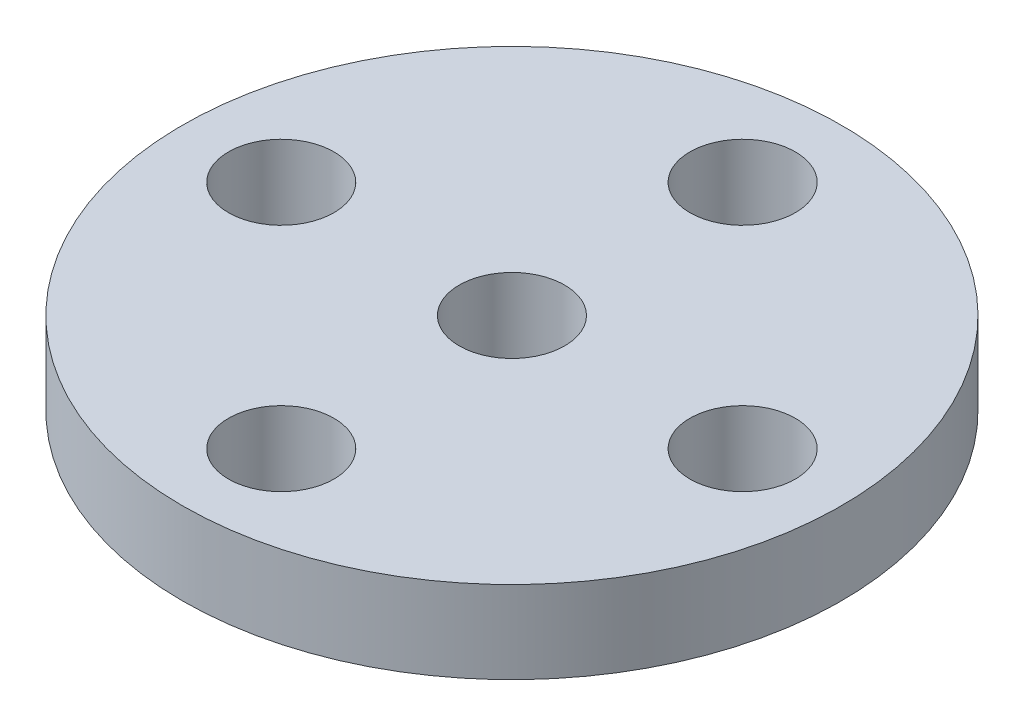
ISO-10303-21;
HEADER;
FILE_DESCRIPTION(('STEP AP214'),'2;1');
FILE_NAME('part.step','',(''),(''),'','','');
FILE_SCHEMA(('AUTOMOTIVE_DESIGN { 1 0 10303 214 1 1 1 1 }'));
ENDSEC;
DATA;
#1=APPLICATION_CONTEXT('core data for automotive mechanical design processes');
#2=APPLICATION_PROTOCOL_DEFINITION('international standard','automotive_design',2000,#1);
#3=PRODUCT_CONTEXT('',#1,'mechanical');
#4=PRODUCT('Part','Part','',(#3));
#5=PRODUCT_RELATED_PRODUCT_CATEGORY('part','',(#4));
#6=PRODUCT_DEFINITION_FORMATION('','',#4);
#7=PRODUCT_DEFINITION_CONTEXT('part definition',#1,'design');
#8=PRODUCT_DEFINITION('design','',#6,#7);
#9=PRODUCT_DEFINITION_SHAPE('','',#8);
#10=(LENGTH_UNIT() NAMED_UNIT(*) SI_UNIT(.MILLI.,.METRE.));
#11=(NAMED_UNIT(*) PLANE_ANGLE_UNIT() SI_UNIT($,.RADIAN.));
#12=(NAMED_UNIT(*) SI_UNIT($,.STERADIAN.) SOLID_ANGLE_UNIT());
#13=UNCERTAINTY_MEASURE_WITH_UNIT(LENGTH_MEASURE(1.E-05),#10,'distance_accuracy_value','');
#14=(GEOMETRIC_REPRESENTATION_CONTEXT(3) GLOBAL_UNCERTAINTY_ASSIGNED_CONTEXT((#13)) GLOBAL_UNIT_ASSIGNED_CONTEXT((#10,
#11,#12)) REPRESENTATION_CONTEXT('',''));
#15=CARTESIAN_POINT('',(0.,0.,0.));
#16=DIRECTION('',(0.,0.,1.));
#17=DIRECTION('',(1.,0.,0.));
#18=AXIS2_PLACEMENT_3D('',#15,#16,#17);
#19=CARTESIAN_POINT('',(0.,2.,0.));
#20=DIRECTION('',(0.,-1.,0.));
#21=DIRECTION('',(0.,0.,-1.));
#22=AXIS2_PLACEMENT_3D('',#19,#20,#21);
#23=CYLINDRICAL_SURFACE('',#22,4.);
#24=CARTESIAN_POINT('',(0.,2.,0.));
#25=DIRECTION('',(0.,1.,0.));
#26=DIRECTION('',(0.,0.,1.));
#27=AXIS2_PLACEMENT_3D('',#24,#25,#26);
#28=CIRCLE('',#27,4.);
#29=CARTESIAN_POINT('',(0.,2.,4.));
#30=VERTEX_POINT('',#29);
#31=EDGE_CURVE('E10',#30,#30,#28,.T.);
#32=ORIENTED_EDGE('',*,*,#31,.F.);
#33=EDGE_LOOP('',(#32));
#34=FACE_BOUND('',#33,.T.);
#35=CARTESIAN_POINT('',(0.,0.,0.));
#36=DIRECTION('',(0.,1.,0.));
#37=DIRECTION('',(0.,0.,1.));
#38=AXIS2_PLACEMENT_3D('',#35,#36,#37);
#39=CIRCLE('',#38,4.);
#40=CARTESIAN_POINT('',(0.,0.,4.));
#41=VERTEX_POINT('',#40);
#42=EDGE_CURVE('E44',#41,#41,#39,.T.);
#43=ORIENTED_EDGE('',*,*,#42,.T.);
#44=EDGE_LOOP('',(#43));
#45=FACE_BOUND('',#44,.T.);
#46=ADVANCED_FACE('F37',(#34,#45),#23,.T.);
#47=CARTESIAN_POINT('',(0.,0.,0.));
#48=DIRECTION('',(0.,1.,0.));
#49=DIRECTION('',(0.,0.,1.));
#50=AXIS2_PLACEMENT_3D('',#47,#48,#49);
#51=PLANE('',#50);
#52=CARTESIAN_POINT('',(0.,0.,0.));
#53=DIRECTION('',(0.,1.,0.));
#54=DIRECTION('',(0.,0.,1.));
#55=AXIS2_PLACEMENT_3D('',#52,#53,#54);
#56=CIRCLE('',#55,1.6);
#57=CARTESIAN_POINT('',(0.,0.,1.6));
#58=VERTEX_POINT('',#57);
#59=EDGE_CURVE('E59',#58,#58,#56,.T.);
#60=ORIENTED_EDGE('',*,*,#59,.T.);
#61=EDGE_LOOP('',(#60));
#62=FACE_BOUND('',#61,.T.);
#63=ORIENTED_EDGE('',*,*,#42,.F.);
#64=EDGE_LOOP('',(#63));
#65=FACE_BOUND('',#64,.T.);
#66=ADVANCED_FACE('F121',(#62,#65),#51,.F.);
#67=CARTESIAN_POINT('',(0.,4.5,0.));
#68=DIRECTION('',(0.,-1.,0.));
#69=DIRECTION('',(0.,0.,-1.));
#70=AXIS2_PLACEMENT_3D('',#67,#68,#69);
#71=CYLINDRICAL_SURFACE('',#70,10.);
#72=CARTESIAN_POINT('',(0.,4.5,0.));
#73=DIRECTION('',(0.,1.,0.));
#74=DIRECTION('',(0.,0.,1.));
#75=AXIS2_PLACEMENT_3D('',#72,#73,#74);
#76=CIRCLE('',#75,10.);
#77=CARTESIAN_POINT('',(0.,4.5,10.));
#78=VERTEX_POINT('',#77);
#79=EDGE_CURVE('E49',#78,#78,#76,.T.);
#80=ORIENTED_EDGE('',*,*,#79,.F.);
#81=EDGE_LOOP('',(#80));
#82=FACE_BOUND('',#81,.T.);
#83=CARTESIAN_POINT('',(0.,2.,0.));
#84=DIRECTION('',(0.,1.,0.));
#85=DIRECTION('',(0.,0.,1.));
#86=AXIS2_PLACEMENT_3D('',#83,#84,#85);
#87=CIRCLE('',#86,10.);
#88=CARTESIAN_POINT('',(0.,2.,10.));
#89=VERTEX_POINT('',#88);
#90=EDGE_CURVE('E52',#89,#89,#87,.T.);
#91=ORIENTED_EDGE('',*,*,#90,.T.);
#92=EDGE_LOOP('',(#91));
#93=FACE_BOUND('',#92,.T.);
#94=ADVANCED_FACE('F100',(#82,#93),#71,.T.);
#95=CARTESIAN_POINT('',(0.,4.5,0.));
#96=DIRECTION('',(0.,1.,0.));
#97=DIRECTION('',(0.,0.,1.));
#98=AXIS2_PLACEMENT_3D('',#95,#96,#97);
#99=PLANE('',#98);
#100=CARTESIAN_POINT('',(0.,4.5,-7.));
#101=DIRECTION('',(0.,1.,0.));
#102=DIRECTION('',(0.,0.,1.));
#103=AXIS2_PLACEMENT_3D('',#100,#101,#102);
#104=CIRCLE('',#103,1.6);
#105=CARTESIAN_POINT('',(0.,4.5,-5.4));
#106=VERTEX_POINT('',#105);
#107=EDGE_CURVE('E78',#106,#106,#104,.T.);
#108=ORIENTED_EDGE('',*,*,#107,.F.);
#109=EDGE_LOOP('',(#108));
#110=FACE_BOUND('',#109,.T.);
#111=CARTESIAN_POINT('',(7.,4.5,0.));
#112=DIRECTION('',(0.,1.,0.));
#113=DIRECTION('',(0.,0.,1.));
#114=AXIS2_PLACEMENT_3D('',#111,#112,#113);
#115=CIRCLE('',#114,1.6);
#116=CARTESIAN_POINT('',(7.,4.5,1.6));
#117=VERTEX_POINT('',#116);
#118=EDGE_CURVE('E81',#117,#117,#115,.T.);
#119=ORIENTED_EDGE('',*,*,#118,.F.);
#120=EDGE_LOOP('',(#119));
#121=FACE_BOUND('',#120,.T.);
#122=CARTESIAN_POINT('',(0.,4.5,7.));
#123=DIRECTION('',(0.,1.,0.));
#124=DIRECTION('',(0.,0.,1.));
#125=AXIS2_PLACEMENT_3D('',#122,#123,#124);
#126=CIRCLE('',#125,1.6);
#127=CARTESIAN_POINT('',(0.,4.5,8.6));
#128=VERTEX_POINT('',#127);
#129=EDGE_CURVE('E84',#128,#128,#126,.T.);
#130=ORIENTED_EDGE('',*,*,#129,.F.);
#131=EDGE_LOOP('',(#130));
#132=FACE_BOUND('',#131,.T.);
#133=CARTESIAN_POINT('',(-7.,4.5,0.));
#134=DIRECTION('',(0.,1.,0.));
#135=DIRECTION('',(0.,0.,1.));
#136=AXIS2_PLACEMENT_3D('',#133,#134,#135);
#137=CIRCLE('',#136,1.6);
#138=CARTESIAN_POINT('',(-7.,4.5,1.6));
#139=VERTEX_POINT('',#138);
#140=EDGE_CURVE('E87',#139,#139,#137,.T.);
#141=ORIENTED_EDGE('',*,*,#140,.F.);
#142=EDGE_LOOP('',(#141));
#143=FACE_BOUND('',#142,.T.);
#144=CARTESIAN_POINT('',(0.,4.5,0.));
#145=DIRECTION('',(0.,1.,0.));
#146=DIRECTION('',(0.,0.,1.));
#147=AXIS2_PLACEMENT_3D('',#144,#145,#146);
#148=CIRCLE('',#147,1.6);
#149=CARTESIAN_POINT('',(0.,4.5,1.6));
#150=VERTEX_POINT('',#149);
#151=EDGE_CURVE('E75',#150,#150,#148,.T.);
#152=ORIENTED_EDGE('',*,*,#151,.F.);
#153=EDGE_LOOP('',(#152));
#154=FACE_BOUND('',#153,.T.);
#155=ORIENTED_EDGE('',*,*,#79,.T.);
#156=EDGE_LOOP('',(#155));
#157=FACE_BOUND('',#156,.T.);
#158=ADVANCED_FACE('F96',(#110,#121,#132,#143,#154,#157),#99,.T.);
#159=CARTESIAN_POINT('',(0.,2.,0.));
#160=DIRECTION('',(0.,1.,0.));
#161=DIRECTION('',(0.,0.,1.));
#162=AXIS2_PLACEMENT_3D('',#159,#160,#161);
#163=PLANE('',#162);
#164=CARTESIAN_POINT('',(0.,2.,-7.));
#165=DIRECTION('',(0.,1.,0.));
#166=DIRECTION('',(0.,0.,1.));
#167=AXIS2_PLACEMENT_3D('',#164,#165,#166);
#168=CIRCLE('',#167,1.6);
#169=CARTESIAN_POINT('',(0.,2.,-5.4));
#170=VERTEX_POINT('',#169);
#171=EDGE_CURVE('E40',#170,#170,#168,.T.);
#172=ORIENTED_EDGE('',*,*,#171,.T.);
#173=EDGE_LOOP('',(#172));
#174=FACE_BOUND('',#173,.T.);
#175=CARTESIAN_POINT('',(7.,2.,0.));
#176=DIRECTION('',(0.,1.,0.));
#177=DIRECTION('',(0.,0.,1.));
#178=AXIS2_PLACEMENT_3D('',#175,#176,#177);
#179=CIRCLE('',#178,1.6);
#180=CARTESIAN_POINT('',(7.,2.,1.6));
#181=VERTEX_POINT('',#180);
#182=EDGE_CURVE('E61',#181,#181,#179,.T.);
#183=ORIENTED_EDGE('',*,*,#182,.T.);
#184=EDGE_LOOP('',(#183));
#185=FACE_BOUND('',#184,.T.);
#186=CARTESIAN_POINT('',(0.,2.,7.));
#187=DIRECTION('',(0.,1.,0.));
#188=DIRECTION('',(0.,0.,1.));
#189=AXIS2_PLACEMENT_3D('',#186,#187,#188);
#190=CIRCLE('',#189,1.6);
#191=CARTESIAN_POINT('',(0.,2.,8.6));
#192=VERTEX_POINT('',#191);
#193=EDGE_CURVE('E58',#192,#192,#190,.T.);
#194=ORIENTED_EDGE('',*,*,#193,.T.);
#195=EDGE_LOOP('',(#194));
#196=FACE_BOUND('',#195,.T.);
#197=CARTESIAN_POINT('',(-7.,2.,0.));
#198=DIRECTION('',(0.,1.,0.));
#199=DIRECTION('',(0.,0.,1.));
#200=AXIS2_PLACEMENT_3D('',#197,#198,#199);
#201=CIRCLE('',#200,1.6);
#202=CARTESIAN_POINT('',(-7.,2.,1.6));
#203=VERTEX_POINT('',#202);
#204=EDGE_CURVE('E55',#203,#203,#201,.T.);
#205=ORIENTED_EDGE('',*,*,#204,.T.);
#206=EDGE_LOOP('',(#205));
#207=FACE_BOUND('',#206,.T.);
#208=ORIENTED_EDGE('',*,*,#31,.T.);
#209=EDGE_LOOP('',(#208));
#210=FACE_BOUND('',#209,.T.);
#211=ORIENTED_EDGE('',*,*,#90,.F.);
#212=EDGE_LOOP('',(#211));
#213=FACE_BOUND('',#212,.T.);
#214=ADVANCED_FACE('F99',(#174,#185,#196,#207,#210,#213),#163,.F.);
#215=CARTESIAN_POINT('',(-7.,0.,0.));
#216=DIRECTION('',(0.,1.,0.));
#217=DIRECTION('',(0.,0.,1.));
#218=AXIS2_PLACEMENT_3D('',#215,#216,#217);
#219=CYLINDRICAL_SURFACE('',#218,1.6);
#220=ORIENTED_EDGE('',*,*,#140,.T.);
#221=EDGE_LOOP('',(#220));
#222=FACE_BOUND('',#221,.T.);
#223=ORIENTED_EDGE('',*,*,#204,.F.);
#224=EDGE_LOOP('',(#223));
#225=FACE_BOUND('',#224,.T.);
#226=ADVANCED_FACE('F137',(#222,#225),#219,.F.);
#227=CARTESIAN_POINT('',(0.,0.,7.));
#228=DIRECTION('',(0.,1.,0.));
#229=DIRECTION('',(0.,0.,1.));
#230=AXIS2_PLACEMENT_3D('',#227,#228,#229);
#231=CYLINDRICAL_SURFACE('',#230,1.6);
#232=ORIENTED_EDGE('',*,*,#129,.T.);
#233=EDGE_LOOP('',(#232));
#234=FACE_BOUND('',#233,.T.);
#235=ORIENTED_EDGE('',*,*,#193,.F.);
#236=EDGE_LOOP('',(#235));
#237=FACE_BOUND('',#236,.T.);
#238=ADVANCED_FACE('F93',(#234,#237),#231,.F.);
#239=CARTESIAN_POINT('',(7.,0.,0.));
#240=DIRECTION('',(0.,1.,0.));
#241=DIRECTION('',(0.,0.,1.));
#242=AXIS2_PLACEMENT_3D('',#239,#240,#241);
#243=CYLINDRICAL_SURFACE('',#242,1.6);
#244=ORIENTED_EDGE('',*,*,#118,.T.);
#245=EDGE_LOOP('',(#244));
#246=FACE_BOUND('',#245,.T.);
#247=ORIENTED_EDGE('',*,*,#182,.F.);
#248=EDGE_LOOP('',(#247));
#249=FACE_BOUND('',#248,.T.);
#250=ADVANCED_FACE('F115',(#246,#249),#243,.F.);
#251=CARTESIAN_POINT('',(0.,0.,-7.));
#252=DIRECTION('',(0.,1.,0.));
#253=DIRECTION('',(0.,0.,1.));
#254=AXIS2_PLACEMENT_3D('',#251,#252,#253);
#255=CYLINDRICAL_SURFACE('',#254,1.6);
#256=ORIENTED_EDGE('',*,*,#107,.T.);
#257=EDGE_LOOP('',(#256));
#258=FACE_BOUND('',#257,.T.);
#259=ORIENTED_EDGE('',*,*,#171,.F.);
#260=EDGE_LOOP('',(#259));
#261=FACE_BOUND('',#260,.T.);
#262=ADVANCED_FACE('F109',(#258,#261),#255,.F.);
#263=CARTESIAN_POINT('',(0.,0.,0.));
#264=DIRECTION('',(0.,1.,0.));
#265=DIRECTION('',(0.,0.,1.));
#266=AXIS2_PLACEMENT_3D('',#263,#264,#265);
#267=CYLINDRICAL_SURFACE('',#266,1.6);
#268=ORIENTED_EDGE('',*,*,#59,.F.);
#269=EDGE_LOOP('',(#268));
#270=FACE_BOUND('',#269,.T.);
#271=ORIENTED_EDGE('',*,*,#151,.T.);
#272=EDGE_LOOP('',(#271));
#273=FACE_BOUND('',#272,.T.);
#274=ADVANCED_FACE('F107',(#270,#273),#267,.F.);
#275=CLOSED_SHELL('',(#46,#66,#94,#158,#214,#226,#238,#250,#262,#274));
#276=MANIFOLD_SOLID_BREP('B2',#275);
#277=ADVANCED_BREP_SHAPE_REPRESENTATION('',(#18,#276),#14);
#278=SHAPE_DEFINITION_REPRESENTATION(#9,#277);
ENDSEC;
END-ISO-10303-21;
